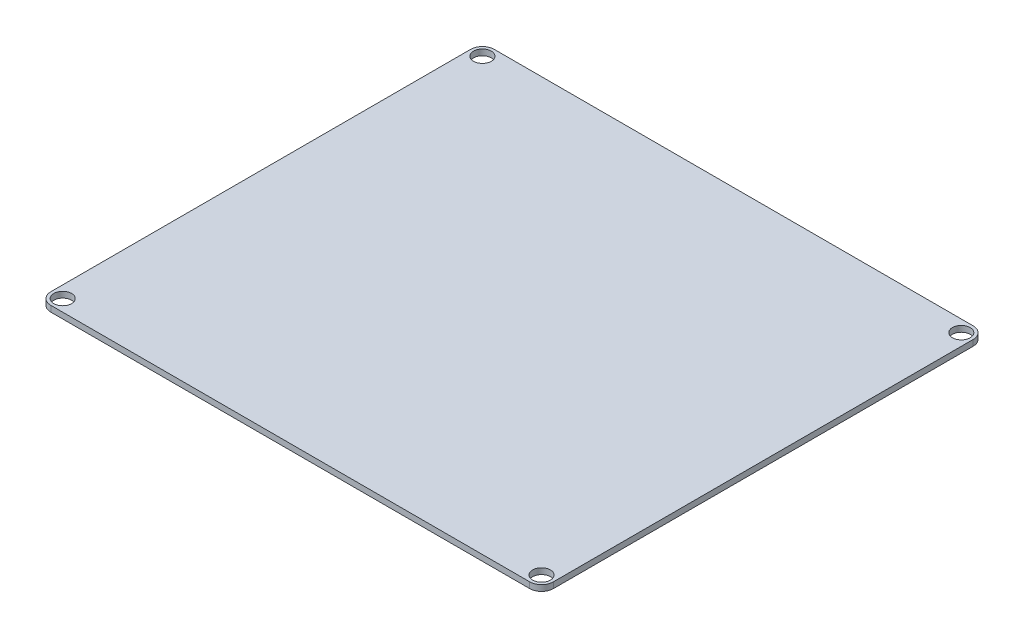
ISO-10303-21;
HEADER;
FILE_DESCRIPTION(('STEP AP214'),'2;1');
FILE_NAME('part.step','',(''),(''),'','','');
FILE_SCHEMA(('AUTOMOTIVE_DESIGN { 1 0 10303 214 1 1 1 1 }'));
ENDSEC;
DATA;
#1=APPLICATION_CONTEXT('core data for automotive mechanical design processes');
#2=APPLICATION_PROTOCOL_DEFINITION('international standard','automotive_design',2000,#1);
#3=PRODUCT_CONTEXT('',#1,'mechanical');
#4=PRODUCT('Part','Part','',(#3));
#5=PRODUCT_RELATED_PRODUCT_CATEGORY('part','',(#4));
#6=PRODUCT_DEFINITION_FORMATION('','',#4);
#7=PRODUCT_DEFINITION_CONTEXT('part definition',#1,'design');
#8=PRODUCT_DEFINITION('design','',#6,#7);
#9=PRODUCT_DEFINITION_SHAPE('','',#8);
#10=(LENGTH_UNIT() NAMED_UNIT(*) SI_UNIT(.MILLI.,.METRE.));
#11=(NAMED_UNIT(*) PLANE_ANGLE_UNIT() SI_UNIT($,.RADIAN.));
#12=(NAMED_UNIT(*) SI_UNIT($,.STERADIAN.) SOLID_ANGLE_UNIT());
#13=UNCERTAINTY_MEASURE_WITH_UNIT(LENGTH_MEASURE(1.E-05),#10,'distance_accuracy_value','');
#14=(GEOMETRIC_REPRESENTATION_CONTEXT(3) GLOBAL_UNCERTAINTY_ASSIGNED_CONTEXT((#13)) GLOBAL_UNIT_ASSIGNED_CONTEXT((#10,
#11,#12)) REPRESENTATION_CONTEXT('',''));
#15=CARTESIAN_POINT('',(0.,0.,0.));
#16=DIRECTION('',(0.,0.,1.));
#17=DIRECTION('',(1.,0.,0.));
#18=AXIS2_PLACEMENT_3D('',#15,#16,#17);
#19=CARTESIAN_POINT('',(-40.5,1.,35.5));
#20=DIRECTION('',(0.,-1.,0.));
#21=DIRECTION('',(0.,0.,-1.));
#22=AXIS2_PLACEMENT_3D('',#19,#20,#21);
#23=PLANE('',#22);
#24=CARTESIAN_POINT('',(-40.5,1.,35.5));
#25=DIRECTION('',(0.,1.,0.));
#26=DIRECTION('',(0.,0.,-1.));
#27=AXIS2_PLACEMENT_3D('',#24,#25,#26);
#28=CIRCLE('',#27,2.);
#29=CARTESIAN_POINT('',(-42.5,1.,35.5));
#30=VERTEX_POINT('',#29);
#31=CARTESIAN_POINT('',(-40.5,1.,37.5));
#32=VERTEX_POINT('',#31);
#33=EDGE_CURVE('E166',#30,#32,#28,.T.);
#34=ORIENTED_EDGE('',*,*,#33,.T.);
#35=DIRECTION('',(1.,0.,0.));
#36=VECTOR('',#35,1.);
#37=CARTESIAN_POINT('',(-40.5,1.,37.5));
#38=LINE('',#37,#36);
#39=CARTESIAN_POINT('',(40.5,1.,37.5));
#40=VERTEX_POINT('',#39);
#41=EDGE_CURVE('E102',#32,#40,#38,.T.);
#42=ORIENTED_EDGE('',*,*,#41,.T.);
#43=CARTESIAN_POINT('',(40.5,1.,35.5));
#44=DIRECTION('',(0.,1.,0.));
#45=DIRECTION('',(0.,0.,1.));
#46=AXIS2_PLACEMENT_3D('',#43,#44,#45);
#47=CIRCLE('',#46,2.);
#48=CARTESIAN_POINT('',(42.5,1.,35.5));
#49=VERTEX_POINT('',#48);
#50=EDGE_CURVE('E187',#40,#49,#47,.T.);
#51=ORIENTED_EDGE('',*,*,#50,.T.);
#52=DIRECTION('',(0.,0.,-1.));
#53=VECTOR('',#52,1.);
#54=CARTESIAN_POINT('',(42.5,1.,35.5));
#55=LINE('',#54,#53);
#56=CARTESIAN_POINT('',(42.5,1.,-35.5));
#57=VERTEX_POINT('',#56);
#58=EDGE_CURVE('E201',#49,#57,#55,.T.);
#59=ORIENTED_EDGE('',*,*,#58,.T.);
#60=CARTESIAN_POINT('',(40.5,1.,-35.5));
#61=DIRECTION('',(0.,1.,0.));
#62=DIRECTION('',(0.,0.,-1.));
#63=AXIS2_PLACEMENT_3D('',#60,#61,#62);
#64=CIRCLE('',#63,2.);
#65=CARTESIAN_POINT('',(40.5,1.,-37.5));
#66=VERTEX_POINT('',#65);
#67=EDGE_CURVE('E121',#57,#66,#64,.T.);
#68=ORIENTED_EDGE('',*,*,#67,.T.);
#69=DIRECTION('',(-1.,0.,0.));
#70=VECTOR('',#69,1.);
#71=CARTESIAN_POINT('',(-40.5,1.,-37.5));
#72=LINE('',#71,#70);
#73=CARTESIAN_POINT('',(-40.5,1.,-37.5));
#74=VERTEX_POINT('',#73);
#75=EDGE_CURVE('E115',#66,#74,#72,.T.);
#76=ORIENTED_EDGE('',*,*,#75,.T.);
#77=CARTESIAN_POINT('',(-40.5,1.,-35.5));
#78=DIRECTION('',(0.,1.,0.));
#79=DIRECTION('',(0.,0.,-1.));
#80=AXIS2_PLACEMENT_3D('',#77,#78,#79);
#81=CIRCLE('',#80,2.);
#82=CARTESIAN_POINT('',(-42.5,1.,-35.5));
#83=VERTEX_POINT('',#82);
#84=EDGE_CURVE('E119',#74,#83,#81,.T.);
#85=ORIENTED_EDGE('',*,*,#84,.T.);
#86=DIRECTION('',(0.,0.,1.));
#87=VECTOR('',#86,1.);
#88=CARTESIAN_POINT('',(-42.5,1.,35.5));
#89=LINE('',#88,#87);
#90=EDGE_CURVE('E59',#83,#30,#89,.T.);
#91=ORIENTED_EDGE('',*,*,#90,.T.);
#92=EDGE_LOOP('',(#34,#42,#51,#59,#68,#76,#85,#91));
#93=FACE_BOUND('',#92,.T.);
#94=CARTESIAN_POINT('',(-40.5,1.,-35.5));
#95=DIRECTION('',(0.,1.,0.));
#96=DIRECTION('',(0.,0.,1.));
#97=AXIS2_PLACEMENT_3D('',#94,#95,#96);
#98=CIRCLE('',#97,1.5);
#99=CARTESIAN_POINT('',(-40.5,1.,-34.));
#100=VERTEX_POINT('',#99);
#101=EDGE_CURVE('E148',#100,#100,#98,.T.);
#102=ORIENTED_EDGE('',*,*,#101,.F.);
#103=EDGE_LOOP('',(#102));
#104=FACE_BOUND('',#103,.T.);
#105=CARTESIAN_POINT('',(40.5,1.,-35.5));
#106=DIRECTION('',(0.,1.,0.));
#107=DIRECTION('',(0.,0.,1.));
#108=AXIS2_PLACEMENT_3D('',#105,#106,#107);
#109=CIRCLE('',#108,1.5);
#110=CARTESIAN_POINT('',(40.5,1.,-34.));
#111=VERTEX_POINT('',#110);
#112=EDGE_CURVE('E215',#111,#111,#109,.T.);
#113=ORIENTED_EDGE('',*,*,#112,.F.);
#114=EDGE_LOOP('',(#113));
#115=FACE_BOUND('',#114,.T.);
#116=CARTESIAN_POINT('',(40.5,1.,35.5));
#117=DIRECTION('',(0.,1.,0.));
#118=DIRECTION('',(0.,0.,1.));
#119=AXIS2_PLACEMENT_3D('',#116,#117,#118);
#120=CIRCLE('',#119,1.5);
#121=CARTESIAN_POINT('',(40.5,1.,37.));
#122=VERTEX_POINT('',#121);
#123=EDGE_CURVE('E223',#122,#122,#120,.T.);
#124=ORIENTED_EDGE('',*,*,#123,.F.);
#125=EDGE_LOOP('',(#124));
#126=FACE_BOUND('',#125,.T.);
#127=CARTESIAN_POINT('',(-40.5,1.,35.5));
#128=DIRECTION('',(0.,1.,0.));
#129=DIRECTION('',(0.,0.,1.));
#130=AXIS2_PLACEMENT_3D('',#127,#128,#129);
#131=CIRCLE('',#130,1.5);
#132=CARTESIAN_POINT('',(-40.5,1.,37.));
#133=VERTEX_POINT('',#132);
#134=EDGE_CURVE('E231',#133,#133,#131,.T.);
#135=ORIENTED_EDGE('',*,*,#134,.F.);
#136=EDGE_LOOP('',(#135));
#137=FACE_BOUND('',#136,.T.);
#138=ADVANCED_FACE('F41',(#93,#104,#115,#126,#137),#23,.F.);
#139=CARTESIAN_POINT('',(-40.5,0.,35.5));
#140=DIRECTION('',(0.,-1.,0.));
#141=DIRECTION('',(0.,0.,-1.));
#142=AXIS2_PLACEMENT_3D('',#139,#140,#141);
#143=PLANE('',#142);
#144=CARTESIAN_POINT('',(40.5,0.,35.5));
#145=DIRECTION('',(0.,1.,0.));
#146=DIRECTION('',(0.,0.,1.));
#147=AXIS2_PLACEMENT_3D('',#144,#145,#146);
#148=CIRCLE('',#147,1.5);
#149=CARTESIAN_POINT('',(40.5,0.,37.));
#150=VERTEX_POINT('',#149);
#151=EDGE_CURVE('E227',#150,#150,#148,.T.);
#152=ORIENTED_EDGE('',*,*,#151,.T.);
#153=EDGE_LOOP('',(#152));
#154=FACE_BOUND('',#153,.T.);
#155=CARTESIAN_POINT('',(-40.5,0.,-35.5));
#156=DIRECTION('',(0.,1.,0.));
#157=DIRECTION('',(0.,0.,1.));
#158=AXIS2_PLACEMENT_3D('',#155,#156,#157);
#159=CIRCLE('',#158,1.5);
#160=CARTESIAN_POINT('',(-40.5,0.,-34.));
#161=VERTEX_POINT('',#160);
#162=EDGE_CURVE('E211',#161,#161,#159,.T.);
#163=ORIENTED_EDGE('',*,*,#162,.T.);
#164=EDGE_LOOP('',(#163));
#165=FACE_BOUND('',#164,.T.);
#166=CARTESIAN_POINT('',(-40.5,0.,35.5));
#167=DIRECTION('',(0.,1.,0.));
#168=DIRECTION('',(0.,0.,-1.));
#169=AXIS2_PLACEMENT_3D('',#166,#167,#168);
#170=CIRCLE('',#169,2.);
#171=CARTESIAN_POINT('',(-42.5,0.,35.5));
#172=VERTEX_POINT('',#171);
#173=CARTESIAN_POINT('',(-40.5,0.,37.5));
#174=VERTEX_POINT('',#173);
#175=EDGE_CURVE('E143',#172,#174,#170,.T.);
#176=ORIENTED_EDGE('',*,*,#175,.F.);
#177=DIRECTION('',(0.,0.,1.));
#178=VECTOR('',#177,1.);
#179=CARTESIAN_POINT('',(-42.5,0.,35.5));
#180=LINE('',#179,#178);
#181=CARTESIAN_POINT('',(-42.5,0.,-35.5));
#182=VERTEX_POINT('',#181);
#183=EDGE_CURVE('E94',#182,#172,#180,.T.);
#184=ORIENTED_EDGE('',*,*,#183,.F.);
#185=CARTESIAN_POINT('',(-40.5,0.,-35.5));
#186=DIRECTION('',(0.,1.,0.));
#187=DIRECTION('',(0.,0.,-1.));
#188=AXIS2_PLACEMENT_3D('',#185,#186,#187);
#189=CIRCLE('',#188,2.);
#190=CARTESIAN_POINT('',(-40.5,0.,-37.5));
#191=VERTEX_POINT('',#190);
#192=EDGE_CURVE('E88',#191,#182,#189,.T.);
#193=ORIENTED_EDGE('',*,*,#192,.F.);
#194=DIRECTION('',(-1.,0.,0.));
#195=VECTOR('',#194,1.);
#196=CARTESIAN_POINT('',(-40.5,0.,-37.5));
#197=LINE('',#196,#195);
#198=CARTESIAN_POINT('',(40.5,0.,-37.5));
#199=VERTEX_POINT('',#198);
#200=EDGE_CURVE('E130',#199,#191,#197,.T.);
#201=ORIENTED_EDGE('',*,*,#200,.F.);
#202=CARTESIAN_POINT('',(40.5,0.,-35.5));
#203=DIRECTION('',(0.,1.,0.));
#204=DIRECTION('',(0.,0.,-1.));
#205=AXIS2_PLACEMENT_3D('',#202,#203,#204);
#206=CIRCLE('',#205,2.);
#207=CARTESIAN_POINT('',(42.5,0.,-35.5));
#208=VERTEX_POINT('',#207);
#209=EDGE_CURVE('E157',#208,#199,#206,.T.);
#210=ORIENTED_EDGE('',*,*,#209,.F.);
#211=DIRECTION('',(0.,0.,-1.));
#212=VECTOR('',#211,1.);
#213=CARTESIAN_POINT('',(42.5,0.,35.5));
#214=LINE('',#213,#212);
#215=CARTESIAN_POINT('',(42.5,0.,35.5));
#216=VERTEX_POINT('',#215);
#217=EDGE_CURVE('E154',#216,#208,#214,.T.);
#218=ORIENTED_EDGE('',*,*,#217,.F.);
#219=CARTESIAN_POINT('',(40.5,0.,35.5));
#220=DIRECTION('',(0.,1.,0.));
#221=DIRECTION('',(0.,0.,1.));
#222=AXIS2_PLACEMENT_3D('',#219,#220,#221);
#223=CIRCLE('',#222,2.);
#224=CARTESIAN_POINT('',(40.5,0.,37.5));
#225=VERTEX_POINT('',#224);
#226=EDGE_CURVE('E151',#225,#216,#223,.T.);
#227=ORIENTED_EDGE('',*,*,#226,.F.);
#228=DIRECTION('',(1.,0.,0.));
#229=VECTOR('',#228,1.);
#230=CARTESIAN_POINT('',(-40.5,0.,37.5));
#231=LINE('',#230,#229);
#232=EDGE_CURVE('E147',#174,#225,#231,.T.);
#233=ORIENTED_EDGE('',*,*,#232,.F.);
#234=EDGE_LOOP('',(#176,#184,#193,#201,#210,#218,#227,#233));
#235=FACE_BOUND('',#234,.T.);
#236=CARTESIAN_POINT('',(40.5,0.,-35.5));
#237=DIRECTION('',(0.,1.,0.));
#238=DIRECTION('',(0.,0.,1.));
#239=AXIS2_PLACEMENT_3D('',#236,#237,#238);
#240=CIRCLE('',#239,1.5);
#241=CARTESIAN_POINT('',(40.5,0.,-34.));
#242=VERTEX_POINT('',#241);
#243=EDGE_CURVE('E219',#242,#242,#240,.T.);
#244=ORIENTED_EDGE('',*,*,#243,.T.);
#245=EDGE_LOOP('',(#244));
#246=FACE_BOUND('',#245,.T.);
#247=CARTESIAN_POINT('',(-40.5,0.,35.5));
#248=DIRECTION('',(0.,1.,0.));
#249=DIRECTION('',(0.,0.,1.));
#250=AXIS2_PLACEMENT_3D('',#247,#248,#249);
#251=CIRCLE('',#250,1.5);
#252=CARTESIAN_POINT('',(-40.5,0.,37.));
#253=VERTEX_POINT('',#252);
#254=EDGE_CURVE('E235',#253,#253,#251,.T.);
#255=ORIENTED_EDGE('',*,*,#254,.T.);
#256=EDGE_LOOP('',(#255));
#257=FACE_BOUND('',#256,.T.);
#258=ADVANCED_FACE('F191',(#154,#165,#235,#246,#257),#143,.T.);
#259=CARTESIAN_POINT('',(-40.5,1.,35.5));
#260=DIRECTION('',(0.,-1.,0.));
#261=DIRECTION('',(0.,0.,-1.));
#262=AXIS2_PLACEMENT_3D('',#259,#260,#261);
#263=CYLINDRICAL_SURFACE('',#262,2.);
#264=ORIENTED_EDGE('',*,*,#175,.T.);
#265=DIRECTION('',(0.,-1.,0.));
#266=VECTOR('',#265,1.);
#267=CARTESIAN_POINT('',(-40.5,1.,37.5));
#268=LINE('',#267,#266);
#269=EDGE_CURVE('E11',#32,#174,#268,.T.);
#270=ORIENTED_EDGE('',*,*,#269,.F.);
#271=ORIENTED_EDGE('',*,*,#33,.F.);
#272=DIRECTION('',(0.,-1.,0.));
#273=VECTOR('',#272,1.);
#274=CARTESIAN_POINT('',(-42.5,1.,35.5));
#275=LINE('',#274,#273);
#276=EDGE_CURVE('E139',#30,#172,#275,.T.);
#277=ORIENTED_EDGE('',*,*,#276,.T.);
#278=EDGE_LOOP('',(#264,#270,#271,#277));
#279=FACE_BOUND('',#278,.T.);
#280=ADVANCED_FACE('F43',(#279),#263,.T.);
#281=CARTESIAN_POINT('',(-40.5,1.,37.5));
#282=DIRECTION('',(0.,0.,-1.));
#283=DIRECTION('',(-1.,0.,0.));
#284=AXIS2_PLACEMENT_3D('',#281,#282,#283);
#285=PLANE('',#284);
#286=ORIENTED_EDGE('',*,*,#232,.T.);
#287=DIRECTION('',(0.,-1.,0.));
#288=VECTOR('',#287,1.);
#289=CARTESIAN_POINT('',(40.5,1.,37.5));
#290=LINE('',#289,#288);
#291=EDGE_CURVE('E51',#40,#225,#290,.T.);
#292=ORIENTED_EDGE('',*,*,#291,.F.);
#293=ORIENTED_EDGE('',*,*,#41,.F.);
#294=ORIENTED_EDGE('',*,*,#269,.T.);
#295=EDGE_LOOP('',(#286,#292,#293,#294));
#296=FACE_BOUND('',#295,.T.);
#297=ADVANCED_FACE('F269',(#296),#285,.F.);
#298=CARTESIAN_POINT('',(40.5,1.,35.5));
#299=DIRECTION('',(0.,-1.,0.));
#300=DIRECTION('',(0.,0.,-1.));
#301=AXIS2_PLACEMENT_3D('',#298,#299,#300);
#302=CYLINDRICAL_SURFACE('',#301,2.);
#303=ORIENTED_EDGE('',*,*,#226,.T.);
#304=DIRECTION('',(0.,-1.,0.));
#305=VECTOR('',#304,1.);
#306=CARTESIAN_POINT('',(42.5,1.,35.5));
#307=LINE('',#306,#305);
#308=EDGE_CURVE('E177',#49,#216,#307,.T.);
#309=ORIENTED_EDGE('',*,*,#308,.F.);
#310=ORIENTED_EDGE('',*,*,#50,.F.);
#311=ORIENTED_EDGE('',*,*,#291,.T.);
#312=EDGE_LOOP('',(#303,#309,#310,#311));
#313=FACE_BOUND('',#312,.T.);
#314=ADVANCED_FACE('F185',(#313),#302,.T.);
#315=CARTESIAN_POINT('',(42.5,1.,35.5));
#316=DIRECTION('',(-1.,0.,0.));
#317=DIRECTION('',(0.,0.,1.));
#318=AXIS2_PLACEMENT_3D('',#315,#316,#317);
#319=PLANE('',#318);
#320=ORIENTED_EDGE('',*,*,#217,.T.);
#321=DIRECTION('',(0.,-1.,0.));
#322=VECTOR('',#321,1.);
#323=CARTESIAN_POINT('',(42.5,1.,-35.5));
#324=LINE('',#323,#322);
#325=EDGE_CURVE('E173',#57,#208,#324,.T.);
#326=ORIENTED_EDGE('',*,*,#325,.F.);
#327=ORIENTED_EDGE('',*,*,#58,.F.);
#328=ORIENTED_EDGE('',*,*,#308,.T.);
#329=EDGE_LOOP('',(#320,#326,#327,#328));
#330=FACE_BOUND('',#329,.T.);
#331=ADVANCED_FACE('F196',(#330),#319,.F.);
#332=CARTESIAN_POINT('',(40.5,1.,-35.5));
#333=DIRECTION('',(0.,-1.,0.));
#334=DIRECTION('',(0.,0.,-1.));
#335=AXIS2_PLACEMENT_3D('',#332,#333,#334);
#336=CYLINDRICAL_SURFACE('',#335,2.);
#337=ORIENTED_EDGE('',*,*,#209,.T.);
#338=DIRECTION('',(0.,-1.,0.));
#339=VECTOR('',#338,1.);
#340=CARTESIAN_POINT('',(40.5,1.,-37.5));
#341=LINE('',#340,#339);
#342=EDGE_CURVE('E132',#66,#199,#341,.T.);
#343=ORIENTED_EDGE('',*,*,#342,.F.);
#344=ORIENTED_EDGE('',*,*,#67,.F.);
#345=ORIENTED_EDGE('',*,*,#325,.T.);
#346=EDGE_LOOP('',(#337,#343,#344,#345));
#347=FACE_BOUND('',#346,.T.);
#348=ADVANCED_FACE('F199',(#347),#336,.T.);
#349=CARTESIAN_POINT('',(-40.5,1.,-37.5));
#350=DIRECTION('',(0.,0.,1.));
#351=DIRECTION('',(1.,0.,0.));
#352=AXIS2_PLACEMENT_3D('',#349,#350,#351);
#353=PLANE('',#352);
#354=ORIENTED_EDGE('',*,*,#200,.T.);
#355=DIRECTION('',(0.,-1.,0.));
#356=VECTOR('',#355,1.);
#357=CARTESIAN_POINT('',(-40.5,1.,-37.5));
#358=LINE('',#357,#356);
#359=EDGE_CURVE('E127',#74,#191,#358,.T.);
#360=ORIENTED_EDGE('',*,*,#359,.F.);
#361=ORIENTED_EDGE('',*,*,#75,.F.);
#362=ORIENTED_EDGE('',*,*,#342,.T.);
#363=EDGE_LOOP('',(#354,#360,#361,#362));
#364=FACE_BOUND('',#363,.T.);
#365=ADVANCED_FACE('F128',(#364),#353,.F.);
#366=CARTESIAN_POINT('',(-40.5,1.,-35.5));
#367=DIRECTION('',(0.,-1.,0.));
#368=DIRECTION('',(0.,0.,-1.));
#369=AXIS2_PLACEMENT_3D('',#366,#367,#368);
#370=CYLINDRICAL_SURFACE('',#369,2.);
#371=ORIENTED_EDGE('',*,*,#192,.T.);
#372=DIRECTION('',(0.,-1.,0.));
#373=VECTOR('',#372,1.);
#374=CARTESIAN_POINT('',(-42.5,1.,-35.5));
#375=LINE('',#374,#373);
#376=EDGE_CURVE('E133',#83,#182,#375,.T.);
#377=ORIENTED_EDGE('',*,*,#376,.F.);
#378=ORIENTED_EDGE('',*,*,#84,.F.);
#379=ORIENTED_EDGE('',*,*,#359,.T.);
#380=EDGE_LOOP('',(#371,#377,#378,#379));
#381=FACE_BOUND('',#380,.T.);
#382=ADVANCED_FACE('F135',(#381),#370,.T.);
#383=CARTESIAN_POINT('',(-42.5,1.,35.5));
#384=DIRECTION('',(1.,0.,0.));
#385=DIRECTION('',(0.,0.,-1.));
#386=AXIS2_PLACEMENT_3D('',#383,#384,#385);
#387=PLANE('',#386);
#388=ORIENTED_EDGE('',*,*,#183,.T.);
#389=ORIENTED_EDGE('',*,*,#276,.F.);
#390=ORIENTED_EDGE('',*,*,#90,.F.);
#391=ORIENTED_EDGE('',*,*,#376,.T.);
#392=EDGE_LOOP('',(#388,#389,#390,#391));
#393=FACE_BOUND('',#392,.T.);
#394=ADVANCED_FACE('F257',(#393),#387,.F.);
#395=CARTESIAN_POINT('',(-40.5,1.,-35.5));
#396=DIRECTION('',(0.,-1.,0.));
#397=DIRECTION('',(0.,0.,-1.));
#398=AXIS2_PLACEMENT_3D('',#395,#396,#397);
#399=CYLINDRICAL_SURFACE('',#398,1.5);
#400=ORIENTED_EDGE('',*,*,#101,.T.);
#401=EDGE_LOOP('',(#400));
#402=FACE_BOUND('',#401,.T.);
#403=ORIENTED_EDGE('',*,*,#162,.F.);
#404=EDGE_LOOP('',(#403));
#405=FACE_BOUND('',#404,.T.);
#406=ADVANCED_FACE('F254',(#402,#405),#399,.F.);
#407=CARTESIAN_POINT('',(40.5,1.,-35.5));
#408=DIRECTION('',(0.,-1.,0.));
#409=DIRECTION('',(0.,0.,-1.));
#410=AXIS2_PLACEMENT_3D('',#407,#408,#409);
#411=CYLINDRICAL_SURFACE('',#410,1.5);
#412=ORIENTED_EDGE('',*,*,#112,.T.);
#413=EDGE_LOOP('',(#412));
#414=FACE_BOUND('',#413,.T.);
#415=ORIENTED_EDGE('',*,*,#243,.F.);
#416=EDGE_LOOP('',(#415));
#417=FACE_BOUND('',#416,.T.);
#418=ADVANCED_FACE('F333',(#414,#417),#411,.F.);
#419=CARTESIAN_POINT('',(40.5,1.,35.5));
#420=DIRECTION('',(0.,-1.,0.));
#421=DIRECTION('',(0.,0.,-1.));
#422=AXIS2_PLACEMENT_3D('',#419,#420,#421);
#423=CYLINDRICAL_SURFACE('',#422,1.5);
#424=ORIENTED_EDGE('',*,*,#123,.T.);
#425=EDGE_LOOP('',(#424));
#426=FACE_BOUND('',#425,.T.);
#427=ORIENTED_EDGE('',*,*,#151,.F.);
#428=EDGE_LOOP('',(#427));
#429=FACE_BOUND('',#428,.T.);
#430=ADVANCED_FACE('F341',(#426,#429),#423,.F.);
#431=CARTESIAN_POINT('',(-40.5,1.,35.5));
#432=DIRECTION('',(0.,-1.,0.));
#433=DIRECTION('',(0.,0.,-1.));
#434=AXIS2_PLACEMENT_3D('',#431,#432,#433);
#435=CYLINDRICAL_SURFACE('',#434,1.5);
#436=ORIENTED_EDGE('',*,*,#134,.T.);
#437=EDGE_LOOP('',(#436));
#438=FACE_BOUND('',#437,.T.);
#439=ORIENTED_EDGE('',*,*,#254,.F.);
#440=EDGE_LOOP('',(#439));
#441=FACE_BOUND('',#440,.T.);
#442=ADVANCED_FACE('F243',(#438,#441),#435,.F.);
#443=CLOSED_SHELL('',(#138,#258,#280,#297,#314,#331,#348,#365,#382,#394,#406,#418,#430,#442));
#444=MANIFOLD_SOLID_BREP('B2',#443);
#445=ADVANCED_BREP_SHAPE_REPRESENTATION('',(#18,#444),#14);
#446=SHAPE_DEFINITION_REPRESENTATION(#9,#445);
ENDSEC;
END-ISO-10303-21;
